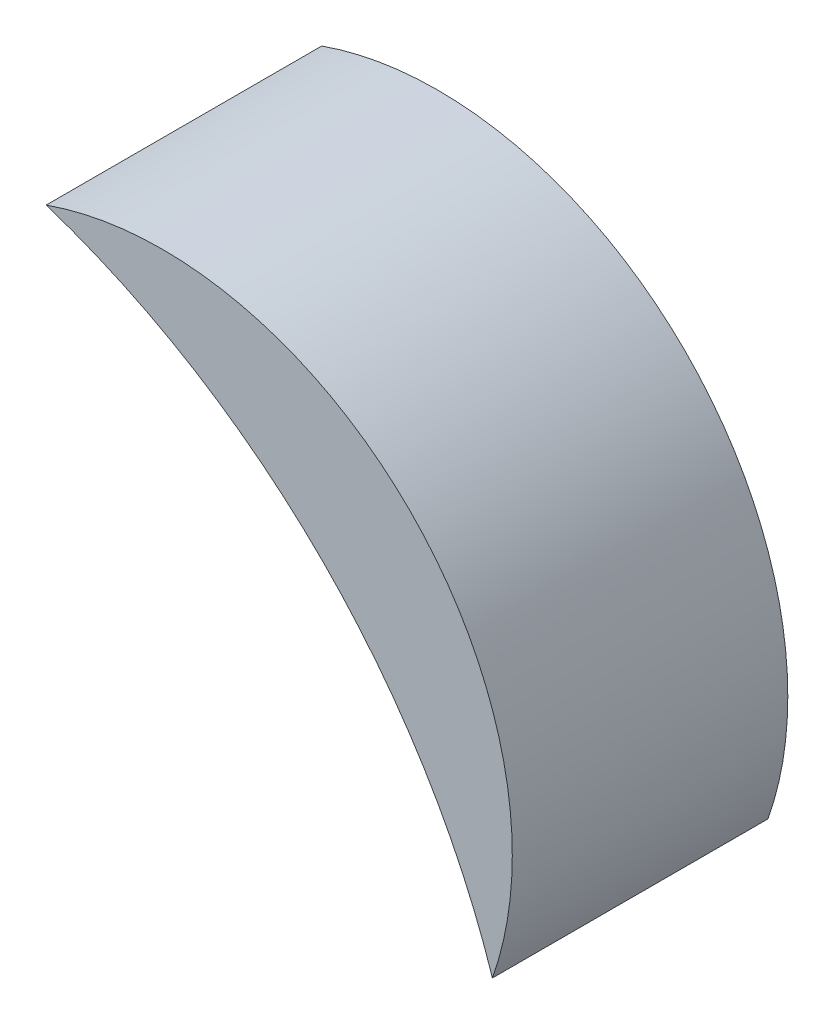
ISO-10303-21;
HEADER;
FILE_DESCRIPTION(('STEP AP214'),'2;1');
FILE_NAME('part.step','',(''),(''),'','','');
FILE_SCHEMA(('AUTOMOTIVE_DESIGN { 1 0 10303 214 1 1 1 1 }'));
ENDSEC;
DATA;
#1=APPLICATION_CONTEXT('core data for automotive mechanical design processes');
#2=APPLICATION_PROTOCOL_DEFINITION('international standard','automotive_design',2000,#1);
#3=PRODUCT_CONTEXT('',#1,'mechanical');
#4=PRODUCT('Part','Part','',(#3));
#5=PRODUCT_RELATED_PRODUCT_CATEGORY('part','',(#4));
#6=PRODUCT_DEFINITION_FORMATION('','',#4);
#7=PRODUCT_DEFINITION_CONTEXT('part definition',#1,'design');
#8=PRODUCT_DEFINITION('design','',#6,#7);
#9=PRODUCT_DEFINITION_SHAPE('','',#8);
#10=(LENGTH_UNIT() NAMED_UNIT(*) SI_UNIT(.MILLI.,.METRE.));
#11=(NAMED_UNIT(*) PLANE_ANGLE_UNIT() SI_UNIT($,.RADIAN.));
#12=(NAMED_UNIT(*) SI_UNIT($,.STERADIAN.) SOLID_ANGLE_UNIT());
#13=UNCERTAINTY_MEASURE_WITH_UNIT(LENGTH_MEASURE(1.E-05),#10,'distance_accuracy_value','');
#14=(GEOMETRIC_REPRESENTATION_CONTEXT(3) GLOBAL_UNCERTAINTY_ASSIGNED_CONTEXT((#13)) GLOBAL_UNIT_ASSIGNED_CONTEXT((#10,
#11,#12)) REPRESENTATION_CONTEXT('',''));
#15=CARTESIAN_POINT('',(0.,0.,0.));
#16=DIRECTION('',(0.,0.,1.));
#17=DIRECTION('',(1.,0.,0.));
#18=AXIS2_PLACEMENT_3D('',#15,#16,#17);
#19=CARTESIAN_POINT('',(153.0240018,101.9700018,0.));
#20=DIRECTION('',(0.,0.,-1.));
#21=DIRECTION('',(0.70710678118652,-0.707106781186576,0.));
#22=AXIS2_PLACEMENT_3D('',#19,#20,#21);
#23=CYLINDRICAL_SURFACE('',#22,0.254001156230761);
#24=CARTESIAN_POINT('',(153.0240018,101.9700018,0.1999996));
#25=DIRECTION('',(0.,0.,1.));
#26=DIRECTION('',(0.70710678118652,-0.707106781186576,0.));
#27=AXIS2_PLACEMENT_3D('',#24,#25,#26);
#28=CIRCLE('',#27,0.254001156230761);
#29=CARTESIAN_POINT('',(153.263589419727,101.885655135334,0.1999996));
#30=VERTEX_POINT('',#29);
#31=CARTESIAN_POINT('',(152.939655135334,102.209589419727,0.1999996));
#32=VERTEX_POINT('',#31);
#33=EDGE_CURVE('E11',#30,#32,#28,.T.);
#34=ORIENTED_EDGE('',*,*,#33,.F.);
#35=DIRECTION('',(0.,0.,1.));
#36=VECTOR('',#35,1.);
#37=CARTESIAN_POINT('',(153.263589419727,101.885655135334,0.));
#38=LINE('',#37,#36);
#39=CARTESIAN_POINT('',(153.263589419727,101.885655135334,0.));
#40=VERTEX_POINT('',#39);
#41=EDGE_CURVE('E24',#40,#30,#38,.T.);
#42=ORIENTED_EDGE('',*,*,#41,.F.);
#43=CARTESIAN_POINT('',(153.0240018,101.9700018,0.));
#44=DIRECTION('',(0.,0.,1.));
#45=DIRECTION('',(0.70710678118652,-0.707106781186576,0.));
#46=AXIS2_PLACEMENT_3D('',#43,#44,#45);
#47=CIRCLE('',#46,0.254001156230761);
#48=CARTESIAN_POINT('',(152.939655135334,102.209589419727,0.));
#49=VERTEX_POINT('',#48);
#50=EDGE_CURVE('E46',#40,#49,#47,.T.);
#51=ORIENTED_EDGE('',*,*,#50,.T.);
#52=DIRECTION('',(0.,0.,1.));
#53=VECTOR('',#52,1.);
#54=CARTESIAN_POINT('',(152.939655135334,102.209589419727,0.));
#55=LINE('',#54,#53);
#56=EDGE_CURVE('E37',#49,#32,#55,.T.);
#57=ORIENTED_EDGE('',*,*,#56,.T.);
#58=EDGE_LOOP('',(#34,#42,#51,#57));
#59=FACE_BOUND('',#58,.T.);
#60=ADVANCED_FACE('F17',(#59),#23,.T.);
#61=CARTESIAN_POINT('',(152.781,101.727,0.));
#62=DIRECTION('',(0.,0.,-1.));
#63=DIRECTION('',(1.,0.,0.));
#64=AXIS2_PLACEMENT_3D('',#61,#62,#63);
#65=CYLINDRICAL_SURFACE('',#64,0.508);
#66=ORIENTED_EDGE('',*,*,#41,.T.);
#67=CARTESIAN_POINT('',(152.781,101.727,0.1999996));
#68=DIRECTION('',(0.,0.,1.));
#69=DIRECTION('',(1.,0.,0.));
#70=AXIS2_PLACEMENT_3D('',#67,#68,#69);
#71=CIRCLE('',#70,0.508);
#72=EDGE_CURVE('E45',#30,#32,#71,.T.);
#73=ORIENTED_EDGE('',*,*,#72,.T.);
#74=ORIENTED_EDGE('',*,*,#56,.F.);
#75=CARTESIAN_POINT('',(152.781,101.727,0.));
#76=DIRECTION('',(0.,0.,1.));
#77=DIRECTION('',(1.,0.,0.));
#78=AXIS2_PLACEMENT_3D('',#75,#76,#77);
#79=CIRCLE('',#78,0.508);
#80=EDGE_CURVE('E43',#40,#49,#79,.T.);
#81=ORIENTED_EDGE('',*,*,#80,.F.);
#82=EDGE_LOOP('',(#66,#73,#74,#81));
#83=FACE_BOUND('',#82,.T.);
#84=ADVANCED_FACE('F41',(#83),#65,.F.);
#85=CARTESIAN_POINT('',(152.96060594,101.54739406,0.));
#86=DIRECTION('',(0.,0.,-1.));
#87=DIRECTION('',(-1.,0.,0.));
#88=AXIS2_PLACEMENT_3D('',#85,#86,#87);
#89=PLANE('',#88);
#90=ORIENTED_EDGE('',*,*,#50,.F.);
#91=ORIENTED_EDGE('',*,*,#80,.T.);
#92=EDGE_LOOP('',(#90,#91));
#93=FACE_BOUND('',#92,.T.);
#94=ADVANCED_FACE('F51',(#93),#89,.T.);
#95=CARTESIAN_POINT('',(152.96060594,101.54739406,0.1999996));
#96=DIRECTION('',(0.,0.,-1.));
#97=DIRECTION('',(-1.,0.,0.));
#98=AXIS2_PLACEMENT_3D('',#95,#96,#97);
#99=PLANE('',#98);
#100=ORIENTED_EDGE('',*,*,#72,.F.);
#101=ORIENTED_EDGE('',*,*,#33,.T.);
#102=EDGE_LOOP('',(#100,#101));
#103=FACE_BOUND('',#102,.T.);
#104=ADVANCED_FACE('F55',(#103),#99,.F.);
#105=CLOSED_SHELL('',(#60,#84,#94,#104));
#106=MANIFOLD_SOLID_BREP('B1',#105);
#107=ADVANCED_BREP_SHAPE_REPRESENTATION('',(#18,#106),#14);
#108=SHAPE_DEFINITION_REPRESENTATION(#9,#107);
ENDSEC;
END-ISO-10303-21;
